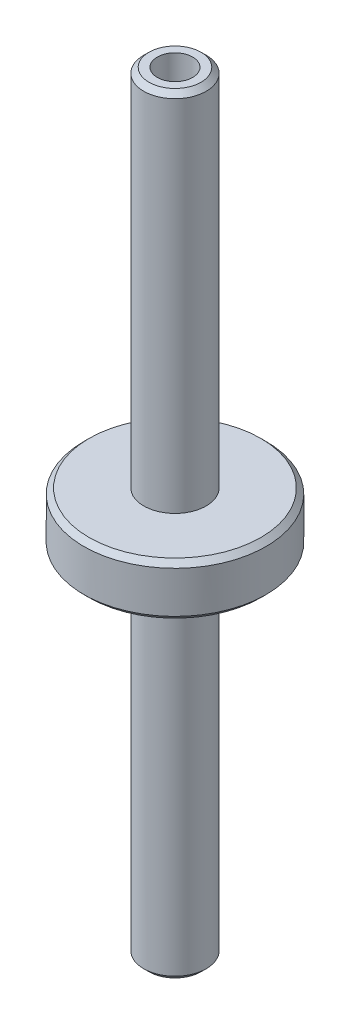
ISO-10303-21;
HEADER;
FILE_DESCRIPTION(('STEP AP214'),'2;1');
FILE_NAME('part.step','',(''),(''),'','','');
FILE_SCHEMA(('AUTOMOTIVE_DESIGN { 1 0 10303 214 1 1 1 1 }'));
ENDSEC;
DATA;
#1=APPLICATION_CONTEXT('core data for automotive mechanical design processes');
#2=APPLICATION_PROTOCOL_DEFINITION('international standard','automotive_design',2000,#1);
#3=PRODUCT_CONTEXT('',#1,'mechanical');
#4=PRODUCT('Part','Part','',(#3));
#5=PRODUCT_RELATED_PRODUCT_CATEGORY('part','',(#4));
#6=PRODUCT_DEFINITION_FORMATION('','',#4);
#7=PRODUCT_DEFINITION_CONTEXT('part definition',#1,'design');
#8=PRODUCT_DEFINITION('design','',#6,#7);
#9=PRODUCT_DEFINITION_SHAPE('','',#8);
#10=(LENGTH_UNIT() NAMED_UNIT(*) SI_UNIT(.MILLI.,.METRE.));
#11=(NAMED_UNIT(*) PLANE_ANGLE_UNIT() SI_UNIT($,.RADIAN.));
#12=(NAMED_UNIT(*) SI_UNIT($,.STERADIAN.) SOLID_ANGLE_UNIT());
#13=UNCERTAINTY_MEASURE_WITH_UNIT(LENGTH_MEASURE(1.E-05),#10,'distance_accuracy_value','');
#14=(GEOMETRIC_REPRESENTATION_CONTEXT(3) GLOBAL_UNCERTAINTY_ASSIGNED_CONTEXT((#13)) GLOBAL_UNIT_ASSIGNED_CONTEXT((#10,
#11,#12)) REPRESENTATION_CONTEXT('',''));
#15=CARTESIAN_POINT('',(0.,0.,0.));
#16=DIRECTION('',(0.,0.,1.));
#17=DIRECTION('',(1.,0.,0.));
#18=AXIS2_PLACEMENT_3D('',#15,#16,#17);
#19=CARTESIAN_POINT('',(-6.00000000000002,70.,0.));
#20=DIRECTION('',(0.,1.,0.));
#21=DIRECTION('',(-1.,0.,0.));
#22=AXIS2_PLACEMENT_3D('',#19,#20,#21);
#23=PLANE('',#22);
#24=CARTESIAN_POINT('',(0.,70.,0.));
#25=DIRECTION('',(0.,1.,0.));
#26=DIRECTION('',(0.,0.,1.));
#27=AXIS2_PLACEMENT_3D('',#24,#25,#26);
#28=CIRCLE('',#27,3.4);
#29=CARTESIAN_POINT('',(0.,70.,3.4));
#30=VERTEX_POINT('',#29);
#31=EDGE_CURVE('E72',#30,#30,#28,.T.);
#32=ORIENTED_EDGE('',*,*,#31,.F.);
#33=EDGE_LOOP('',(#32));
#34=FACE_BOUND('',#33,.T.);
#35=CARTESIAN_POINT('',(0.,70.,0.));
#36=DIRECTION('',(0.,1.,0.));
#37=DIRECTION('',(-1.,0.,0.));
#38=AXIS2_PLACEMENT_3D('',#35,#36,#37);
#39=CIRCLE('',#38,5.00000000000003);
#40=CARTESIAN_POINT('',(-5.00000000000003,70.,0.));
#41=VERTEX_POINT('',#40);
#42=EDGE_CURVE('E58',#41,#41,#39,.T.);
#43=ORIENTED_EDGE('',*,*,#42,.T.);
#44=EDGE_LOOP('',(#43));
#45=FACE_BOUND('',#44,.T.);
#46=ADVANCED_FACE('F50',(#34,#45),#23,.T.);
#47=CARTESIAN_POINT('',(0.,-78.,0.));
#48=DIRECTION('',(0.,-1.,0.));
#49=DIRECTION('',(1.,0.,0.));
#50=AXIS2_PLACEMENT_3D('',#47,#48,#49);
#51=PLANE('',#50);
#52=CARTESIAN_POINT('',(0.,-78.,0.));
#53=DIRECTION('',(0.,-1.,0.));
#54=DIRECTION('',(1.,0.,0.));
#55=AXIS2_PLACEMENT_3D('',#52,#53,#54);
#56=CIRCLE('',#55,5.00000000000006);
#57=CARTESIAN_POINT('',(5.00000000000007,-78.,0.));
#58=VERTEX_POINT('',#57);
#59=EDGE_CURVE('E90',#58,#58,#56,.T.);
#60=ORIENTED_EDGE('',*,*,#59,.T.);
#61=EDGE_LOOP('',(#60));
#62=FACE_BOUND('',#61,.T.);
#63=ADVANCED_FACE('F125',(#62),#51,.T.);
#64=CARTESIAN_POINT('',(0.,34.427667764551,0.));
#65=DIRECTION('',(0.,1.,0.));
#66=DIRECTION('',(-1.,0.,0.));
#67=AXIS2_PLACEMENT_3D('',#64,#65,#66);
#68=CYLINDRICAL_SURFACE('',#67,6.00000000000001);
#69=CARTESIAN_POINT('',(0.,-77.,0.));
#70=DIRECTION('',(0.,-1.,0.));
#71=DIRECTION('',(1.,0.,0.));
#72=AXIS2_PLACEMENT_3D('',#69,#70,#71);
#73=CIRCLE('',#72,6.00000000000001);
#74=CARTESIAN_POINT('',(6.00000000000002,-77.,0.));
#75=VERTEX_POINT('',#74);
#76=EDGE_CURVE('E86',#75,#75,#73,.F.);
#77=ORIENTED_EDGE('',*,*,#76,.T.);
#78=EDGE_LOOP('',(#77));
#79=FACE_BOUND('',#78,.T.);
#80=CARTESIAN_POINT('',(0.,-10.,0.));
#81=DIRECTION('',(0.,1.,0.));
#82=DIRECTION('',(-1.,0.,0.));
#83=AXIS2_PLACEMENT_3D('',#80,#81,#82);
#84=CIRCLE('',#83,6.);
#85=CARTESIAN_POINT('',(-6.,-10.,0.));
#86=VERTEX_POINT('',#85);
#87=EDGE_CURVE('E78',#86,#86,#84,.T.);
#88=ORIENTED_EDGE('',*,*,#87,.F.);
#89=EDGE_LOOP('',(#88));
#90=FACE_BOUND('',#89,.T.);
#91=ADVANCED_FACE('F131',(#79,#90),#68,.T.);
#92=CARTESIAN_POINT('',(-6.,-9.99999999999999,0.));
#93=DIRECTION('',(0.,-1.,0.));
#94=DIRECTION('',(1.,0.,0.));
#95=AXIS2_PLACEMENT_3D('',#92,#93,#94);
#96=PLANE('',#95);
#97=CARTESIAN_POINT('',(0.,-9.99999999999999,0.));
#98=DIRECTION('',(0.,-1.,0.));
#99=DIRECTION('',(1.,0.,0.));
#100=AXIS2_PLACEMENT_3D('',#97,#98,#99);
#101=CIRCLE('',#100,16.5);
#102=CARTESIAN_POINT('',(16.5,-9.99999999999999,0.));
#103=VERTEX_POINT('',#102);
#104=EDGE_CURVE('E106',#103,#103,#101,.T.);
#105=ORIENTED_EDGE('',*,*,#104,.T.);
#106=EDGE_LOOP('',(#105));
#107=FACE_BOUND('',#106,.T.);
#108=ORIENTED_EDGE('',*,*,#87,.T.);
#109=EDGE_LOOP('',(#108));
#110=FACE_BOUND('',#109,.T.);
#111=ADVANCED_FACE('F166',(#107,#110),#96,.T.);
#112=CARTESIAN_POINT('',(0.,34.427667764551,0.));
#113=DIRECTION('',(0.,1.,0.));
#114=DIRECTION('',(-1.,0.,0.));
#115=AXIS2_PLACEMENT_3D('',#112,#113,#114);
#116=CYLINDRICAL_SURFACE('',#115,17.5);
#117=CARTESIAN_POINT('',(0.,-1.00000000000003,0.));
#118=DIRECTION('',(0.,1.,0.));
#119=DIRECTION('',(-1.,0.,0.));
#120=AXIS2_PLACEMENT_3D('',#117,#118,#119);
#121=CIRCLE('',#120,17.5);
#122=CARTESIAN_POINT('',(-17.5,-1.00000000000003,0.));
#123=VERTEX_POINT('',#122);
#124=EDGE_CURVE('E102',#123,#123,#121,.F.);
#125=ORIENTED_EDGE('',*,*,#124,.T.);
#126=EDGE_LOOP('',(#125));
#127=FACE_BOUND('',#126,.T.);
#128=CARTESIAN_POINT('',(0.,-8.99999999999998,0.));
#129=DIRECTION('',(0.,-1.,0.));
#130=DIRECTION('',(1.,0.,0.));
#131=AXIS2_PLACEMENT_3D('',#128,#129,#130);
#132=CIRCLE('',#131,17.5);
#133=CARTESIAN_POINT('',(17.5,-8.99999999999998,0.));
#134=VERTEX_POINT('',#133);
#135=EDGE_CURVE('E98',#134,#134,#132,.F.);
#136=ORIENTED_EDGE('',*,*,#135,.T.);
#137=EDGE_LOOP('',(#136));
#138=FACE_BOUND('',#137,.T.);
#139=ADVANCED_FACE('F153',(#127,#138),#116,.T.);
#140=CARTESIAN_POINT('',(-17.5,0.,0.));
#141=DIRECTION('',(0.,1.,0.));
#142=DIRECTION('',(-1.,0.,0.));
#143=AXIS2_PLACEMENT_3D('',#140,#141,#142);
#144=PLANE('',#143);
#145=CARTESIAN_POINT('',(0.,0.,0.));
#146=DIRECTION('',(0.,1.,0.));
#147=DIRECTION('',(-1.,0.,0.));
#148=AXIS2_PLACEMENT_3D('',#145,#146,#147);
#149=CIRCLE('',#148,16.5);
#150=CARTESIAN_POINT('',(-16.5,0.,0.));
#151=VERTEX_POINT('',#150);
#152=EDGE_CURVE('E94',#151,#151,#149,.T.);
#153=ORIENTED_EDGE('',*,*,#152,.T.);
#154=EDGE_LOOP('',(#153));
#155=FACE_BOUND('',#154,.T.);
#156=CARTESIAN_POINT('',(0.,0.,0.));
#157=DIRECTION('',(0.,1.,0.));
#158=DIRECTION('',(-1.,0.,0.));
#159=AXIS2_PLACEMENT_3D('',#156,#157,#158);
#160=CIRCLE('',#159,6.00000000000002);
#161=CARTESIAN_POINT('',(-6.00000000000002,0.,0.));
#162=VERTEX_POINT('',#161);
#163=EDGE_CURVE('E71',#162,#162,#160,.T.);
#164=ORIENTED_EDGE('',*,*,#163,.F.);
#165=EDGE_LOOP('',(#164));
#166=FACE_BOUND('',#165,.T.);
#167=ADVANCED_FACE('F150',(#155,#166),#144,.T.);
#168=CARTESIAN_POINT('',(0.,34.427667764551,0.));
#169=DIRECTION('',(0.,1.,0.));
#170=DIRECTION('',(-1.,0.,0.));
#171=AXIS2_PLACEMENT_3D('',#168,#169,#170);
#172=CYLINDRICAL_SURFACE('',#171,6.00000000000002);
#173=CARTESIAN_POINT('',(0.,69.,0.));
#174=DIRECTION('',(0.,1.,0.));
#175=DIRECTION('',(-1.,0.,0.));
#176=AXIS2_PLACEMENT_3D('',#173,#174,#175);
#177=CIRCLE('',#176,6.00000000000002);
#178=CARTESIAN_POINT('',(-6.00000000000002,69.,0.));
#179=VERTEX_POINT('',#178);
#180=EDGE_CURVE('E11',#179,#179,#177,.F.);
#181=ORIENTED_EDGE('',*,*,#180,.T.);
#182=EDGE_LOOP('',(#181));
#183=FACE_BOUND('',#182,.T.);
#184=ORIENTED_EDGE('',*,*,#163,.T.);
#185=EDGE_LOOP('',(#184));
#186=FACE_BOUND('',#185,.T.);
#187=ADVANCED_FACE('F140',(#183,#186),#172,.T.);
#188=CARTESIAN_POINT('',(0.,-77.,0.));
#189=DIRECTION('',(0.,1.,0.));
#190=DIRECTION('',(-1.,0.,0.));
#191=AXIS2_PLACEMENT_3D('',#188,#189,#190);
#192=CONICAL_SURFACE('',#191,6.00000000000001,0.785398163397437);
#193=ORIENTED_EDGE('',*,*,#59,.F.);
#194=EDGE_LOOP('',(#193));
#195=FACE_BOUND('',#194,.T.);
#196=ORIENTED_EDGE('',*,*,#76,.F.);
#197=EDGE_LOOP('',(#196));
#198=FACE_BOUND('',#197,.T.);
#199=ADVANCED_FACE('F137',(#195,#198),#192,.T.);
#200=CARTESIAN_POINT('',(0.,0.,0.));
#201=DIRECTION('',(0.,-1.,0.));
#202=DIRECTION('',(1.,0.,0.));
#203=AXIS2_PLACEMENT_3D('',#200,#201,#202);
#204=CONICAL_SURFACE('',#203,16.5,0.785398163397447);
#205=ORIENTED_EDGE('',*,*,#124,.F.);
#206=EDGE_LOOP('',(#205));
#207=FACE_BOUND('',#206,.T.);
#208=ORIENTED_EDGE('',*,*,#152,.F.);
#209=EDGE_LOOP('',(#208));
#210=FACE_BOUND('',#209,.T.);
#211=ADVANCED_FACE('F121',(#207,#210),#204,.T.);
#212=CARTESIAN_POINT('',(0.,-8.99999999999998,0.));
#213=DIRECTION('',(0.,1.,0.));
#214=DIRECTION('',(-1.,0.,0.));
#215=AXIS2_PLACEMENT_3D('',#212,#213,#214);
#216=CONICAL_SURFACE('',#215,17.5,0.78539816339745);
#217=ORIENTED_EDGE('',*,*,#104,.F.);
#218=EDGE_LOOP('',(#217));
#219=FACE_BOUND('',#218,.T.);
#220=ORIENTED_EDGE('',*,*,#135,.F.);
#221=EDGE_LOOP('',(#220));
#222=FACE_BOUND('',#221,.T.);
#223=ADVANCED_FACE('F116',(#219,#222),#216,.T.);
#224=CARTESIAN_POINT('',(0.,70.,0.));
#225=DIRECTION('',(0.,-1.,0.));
#226=DIRECTION('',(1.,0.,0.));
#227=AXIS2_PLACEMENT_3D('',#224,#225,#226);
#228=CONICAL_SURFACE('',#227,5.00000000000003,0.785398163397441);
#229=ORIENTED_EDGE('',*,*,#180,.F.);
#230=EDGE_LOOP('',(#229));
#231=FACE_BOUND('',#230,.T.);
#232=ORIENTED_EDGE('',*,*,#42,.F.);
#233=EDGE_LOOP('',(#232));
#234=FACE_BOUND('',#233,.T.);
#235=ADVANCED_FACE('F52',(#231,#234),#228,.T.);
#236=CARTESIAN_POINT('',(0.,48.,0.));
#237=DIRECTION('',(0.,1.,0.));
#238=DIRECTION('',(0.,0.,1.));
#239=AXIS2_PLACEMENT_3D('',#236,#237,#238);
#240=CONICAL_SURFACE('',#239,3.39999999999999,1.02974425867665);
#241=CARTESIAN_POINT('',(0.,45.9570738953063,0.));
#242=VERTEX_POINT('',#241);
#243=VERTEX_LOOP('',#242);
#244=FACE_BOUND('',#243,.T.);
#245=CARTESIAN_POINT('',(0.,48.,0.));
#246=DIRECTION('',(0.,1.,0.));
#247=DIRECTION('',(0.,0.,1.));
#248=AXIS2_PLACEMENT_3D('',#245,#246,#247);
#249=CIRCLE('',#248,3.39999999999999);
#250=CARTESIAN_POINT('',(0.,48.,3.39999999999999));
#251=VERTEX_POINT('',#250);
#252=EDGE_CURVE('E68',#251,#251,#249,.T.);
#253=ORIENTED_EDGE('',*,*,#252,.T.);
#254=EDGE_LOOP('',(#253));
#255=FACE_BOUND('',#254,.T.);
#256=ADVANCED_FACE('F61',(#244,#255),#240,.F.);
#257=CARTESIAN_POINT('',(0.,70.,0.));
#258=DIRECTION('',(0.,1.,0.));
#259=DIRECTION('',(0.,0.,1.));
#260=AXIS2_PLACEMENT_3D('',#257,#258,#259);
#261=CYLINDRICAL_SURFACE('',#260,3.4);
#262=ORIENTED_EDGE('',*,*,#252,.F.);
#263=EDGE_LOOP('',(#262));
#264=FACE_BOUND('',#263,.T.);
#265=ORIENTED_EDGE('',*,*,#31,.T.);
#266=EDGE_LOOP('',(#265));
#267=FACE_BOUND('',#266,.T.);
#268=ADVANCED_FACE('F64',(#264,#267),#261,.F.);
#269=CLOSED_SHELL('',(#46,#63,#91,#111,#139,#167,#187,#199,#211,#223,#235,#256,#268));
#270=MANIFOLD_SOLID_BREP('B2',#269);
#271=ADVANCED_BREP_SHAPE_REPRESENTATION('',(#18,#270),#14);
#272=SHAPE_DEFINITION_REPRESENTATION(#9,#271);
ENDSEC;
END-ISO-10303-21;
